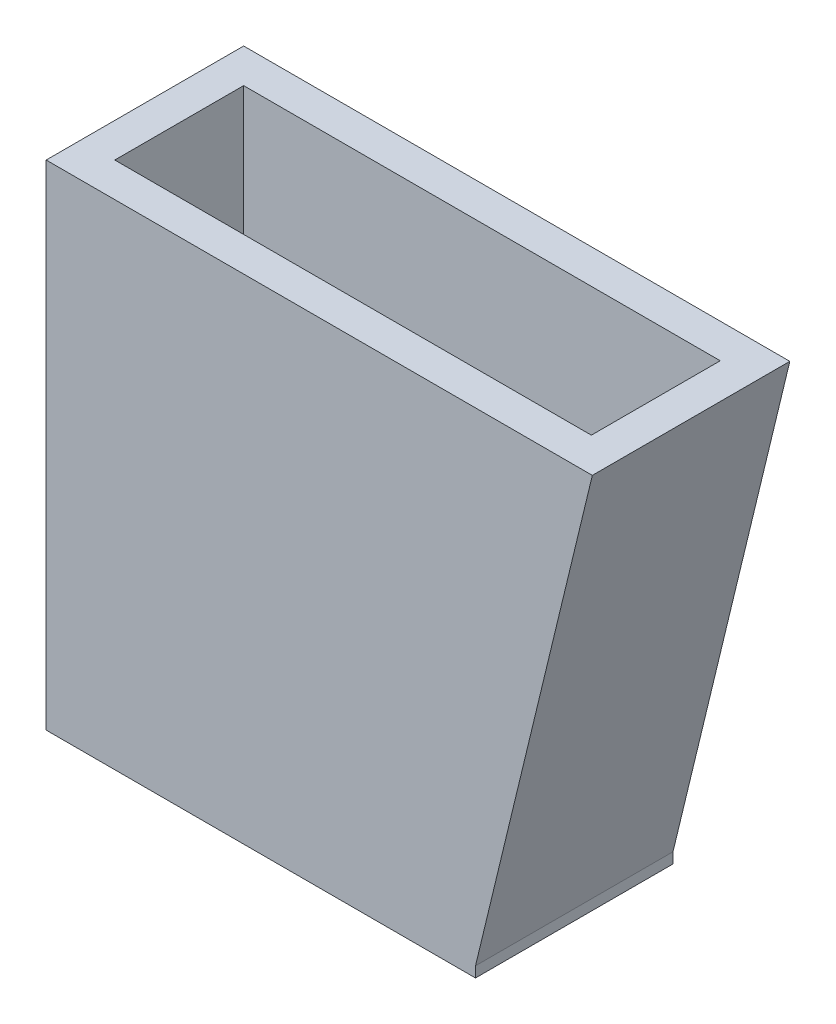
ISO-10303-21;
HEADER;
FILE_DESCRIPTION(('STEP AP214'),'2;1');
FILE_NAME('part.step','',(''),(''),'','','');
FILE_SCHEMA(('AUTOMOTIVE_DESIGN { 1 0 10303 214 1 1 1 1 }'));
ENDSEC;
DATA;
#1=APPLICATION_CONTEXT('core data for automotive mechanical design processes');
#2=APPLICATION_PROTOCOL_DEFINITION('international standard','automotive_design',2000,#1);
#3=PRODUCT_CONTEXT('',#1,'mechanical');
#4=PRODUCT('Part','Part','',(#3));
#5=PRODUCT_RELATED_PRODUCT_CATEGORY('part','',(#4));
#6=PRODUCT_DEFINITION_FORMATION('','',#4);
#7=PRODUCT_DEFINITION_CONTEXT('part definition',#1,'design');
#8=PRODUCT_DEFINITION('design','',#6,#7);
#9=PRODUCT_DEFINITION_SHAPE('','',#8);
#10=(LENGTH_UNIT() NAMED_UNIT(*) SI_UNIT(.MILLI.,.METRE.));
#11=(NAMED_UNIT(*) PLANE_ANGLE_UNIT() SI_UNIT($,.RADIAN.));
#12=(NAMED_UNIT(*) SI_UNIT($,.STERADIAN.) SOLID_ANGLE_UNIT());
#13=UNCERTAINTY_MEASURE_WITH_UNIT(LENGTH_MEASURE(1.E-05),#10,'distance_accuracy_value','');
#14=(GEOMETRIC_REPRESENTATION_CONTEXT(3) GLOBAL_UNCERTAINTY_ASSIGNED_CONTEXT((#13)) GLOBAL_UNIT_ASSIGNED_CONTEXT((#10,
#11,#12)) REPRESENTATION_CONTEXT('',''));
#15=CARTESIAN_POINT('',(0.,0.,0.));
#16=DIRECTION('',(0.,0.,1.));
#17=DIRECTION('',(1.,0.,0.));
#18=AXIS2_PLACEMENT_3D('',#15,#16,#17);
#19=CARTESIAN_POINT('',(20.,255.,0.));
#20=DIRECTION('',(0.,1.,0.));
#21=DIRECTION('',(0.,0.,1.));
#22=AXIS2_PLACEMENT_3D('',#19,#20,#21);
#23=PLANE('',#22);
#24=DIRECTION('',(-1.,0.,0.));
#25=VECTOR('',#24,1.);
#26=CARTESIAN_POINT('',(-105.,255.,66.99));
#27=LINE('',#26,#25);
#28=CARTESIAN_POINT('',(12.01,255.,66.99));
#29=VERTEX_POINT('',#28);
#30=CARTESIAN_POINT('',(-72.01,255.,66.99));
#31=VERTEX_POINT('',#30);
#32=EDGE_CURVE('E45',#29,#31,#27,.T.);
#33=ORIENTED_EDGE('',*,*,#32,.T.);
#34=DIRECTION('',(0.,0.,-1.));
#35=VECTOR('',#34,1.);
#36=CARTESIAN_POINT('',(-72.01,255.,105.));
#37=LINE('',#36,#35);
#38=CARTESIAN_POINT('',(-72.01,255.,97.01));
#39=VERTEX_POINT('',#38);
#40=EDGE_CURVE('E157',#39,#31,#37,.T.);
#41=ORIENTED_EDGE('',*,*,#40,.F.);
#42=DIRECTION('',(-1.,0.,0.));
#43=VECTOR('',#42,1.);
#44=CARTESIAN_POINT('',(0.,255.,97.01));
#45=LINE('',#44,#43);
#46=CARTESIAN_POINT('',(12.01,255.,97.01));
#47=VERTEX_POINT('',#46);
#48=EDGE_CURVE('E127',#47,#39,#45,.T.);
#49=ORIENTED_EDGE('',*,*,#48,.F.);
#50=DIRECTION('',(0.,0.,-1.));
#51=VECTOR('',#50,1.);
#52=CARTESIAN_POINT('',(12.01,255.,105.));
#53=LINE('',#52,#51);
#54=EDGE_CURVE('E158',#47,#29,#53,.T.);
#55=ORIENTED_EDGE('',*,*,#54,.T.);
#56=EDGE_LOOP('',(#33,#41,#49,#55));
#57=FACE_BOUND('',#56,.T.);
#58=DIRECTION('',(-1.,0.,0.));
#59=VECTOR('',#58,1.);
#60=CARTESIAN_POINT('',(0.,255.,105.));
#61=LINE('',#60,#59);
#62=CARTESIAN_POINT('',(20.,255.,105.));
#63=VERTEX_POINT('',#62);
#64=CARTESIAN_POINT('',(-80.,255.,105.));
#65=VERTEX_POINT('',#64);
#66=EDGE_CURVE('E50',#63,#65,#61,.T.);
#67=ORIENTED_EDGE('',*,*,#66,.T.);
#68=DIRECTION('',(0.,0.,-1.));
#69=VECTOR('',#68,1.);
#70=CARTESIAN_POINT('',(-80.,255.,105.));
#71=LINE('',#70,#69);
#72=CARTESIAN_POINT('',(-80.,255.,59.));
#73=VERTEX_POINT('',#72);
#74=EDGE_CURVE('E152',#65,#73,#71,.T.);
#75=ORIENTED_EDGE('',*,*,#74,.T.);
#76=DIRECTION('',(1.,0.,0.));
#77=VECTOR('',#76,1.);
#78=CARTESIAN_POINT('',(-105.,255.,59.));
#79=LINE('',#78,#77);
#80=CARTESIAN_POINT('',(20.,255.,59.));
#81=VERTEX_POINT('',#80);
#82=EDGE_CURVE('E11',#73,#81,#79,.T.);
#83=ORIENTED_EDGE('',*,*,#82,.T.);
#84=DIRECTION('',(0.,0.,-1.));
#85=VECTOR('',#84,1.);
#86=CARTESIAN_POINT('',(20.,255.,105.));
#87=LINE('',#86,#85);
#88=EDGE_CURVE('E58',#63,#81,#87,.T.);
#89=ORIENTED_EDGE('',*,*,#88,.F.);
#90=EDGE_LOOP('',(#67,#75,#83,#89));
#91=FACE_BOUND('',#90,.T.);
#92=ADVANCED_FACE('F42',(#57,#91),#23,.F.);
#93=CARTESIAN_POINT('',(-47.6888596699602,11.5317898279554,105.));
#94=DIRECTION('',(-0.971985961105254,0.235038914680729,0.));
#95=DIRECTION('',(-0.235038914680729,-0.971985961105254,0.));
#96=AXIS2_PLACEMENT_3D('',#93,#94,#95);
#97=PLANE('',#96);
#98=DIRECTION('',(0.235038914680729,0.971985961105254,0.));
#99=VECTOR('',#98,1.);
#100=CARTESIAN_POINT('',(-47.6888596699602,11.5317898279554,97.01));
#101=LINE('',#100,#99);
#102=CARTESIAN_POINT('',(12.01,258.411986547786,97.01));
#103=VERTEX_POINT('',#102);
#104=CARTESIAN_POINT('',(38.993440731349,370.,97.01));
#105=VERTEX_POINT('',#104);
#106=EDGE_CURVE('E168',#103,#105,#101,.T.);
#107=ORIENTED_EDGE('',*,*,#106,.T.);
#108=DIRECTION('',(0.,0.,-1.));
#109=VECTOR('',#108,1.);
#110=CARTESIAN_POINT('',(38.993440731349,370.,105.));
#111=LINE('',#110,#109);
#112=CARTESIAN_POINT('',(38.993440731349,370.,66.99));
#113=VERTEX_POINT('',#112);
#114=EDGE_CURVE('E146',#105,#113,#111,.T.);
#115=ORIENTED_EDGE('',*,*,#114,.T.);
#116=DIRECTION('',(0.235038914680729,0.971985961105254,0.));
#117=VECTOR('',#116,1.);
#118=CARTESIAN_POINT('',(-47.6888596699602,11.5317898279554,66.9900000000001));
#119=LINE('',#118,#117);
#120=CARTESIAN_POINT('',(12.01,258.411986547786,66.99));
#121=VERTEX_POINT('',#120);
#122=EDGE_CURVE('E130',#121,#113,#119,.T.);
#123=ORIENTED_EDGE('',*,*,#122,.F.);
#124=DIRECTION('',(0.,0.,-1.));
#125=VECTOR('',#124,1.);
#126=CARTESIAN_POINT('',(12.01,258.411986547786,105.));
#127=LINE('',#126,#125);
#128=EDGE_CURVE('E178',#103,#121,#127,.T.);
#129=ORIENTED_EDGE('',*,*,#128,.F.);
#130=EDGE_LOOP('',(#107,#115,#123,#129));
#131=FACE_BOUND('',#130,.T.);
#132=ADVANCED_FACE('F218',(#131),#97,.T.);
#133=CARTESIAN_POINT('',(-80.,0.,105.));
#134=DIRECTION('',(-1.,0.,0.));
#135=DIRECTION('',(0.,0.,1.));
#136=AXIS2_PLACEMENT_3D('',#133,#134,#135);
#137=PLANE('',#136);
#138=ORIENTED_EDGE('',*,*,#74,.F.);
#139=DIRECTION('',(0.,1.,0.));
#140=VECTOR('',#139,1.);
#141=CARTESIAN_POINT('',(-80.,0.,105.));
#142=LINE('',#141,#140);
#143=CARTESIAN_POINT('',(-80.,370.,105.));
#144=VERTEX_POINT('',#143);
#145=EDGE_CURVE('E186',#65,#144,#142,.T.);
#146=ORIENTED_EDGE('',*,*,#145,.T.);
#147=DIRECTION('',(0.,0.,-1.));
#148=VECTOR('',#147,1.);
#149=CARTESIAN_POINT('',(-80.,370.,105.));
#150=LINE('',#149,#148);
#151=CARTESIAN_POINT('',(-80.,370.,59.));
#152=VERTEX_POINT('',#151);
#153=EDGE_CURVE('E193',#144,#152,#150,.T.);
#154=ORIENTED_EDGE('',*,*,#153,.T.);
#155=DIRECTION('',(0.,1.,0.));
#156=VECTOR('',#155,1.);
#157=CARTESIAN_POINT('',(-80.,0.,59.0000000000001));
#158=LINE('',#157,#156);
#159=EDGE_CURVE('E188',#73,#152,#158,.T.);
#160=ORIENTED_EDGE('',*,*,#159,.F.);
#161=EDGE_LOOP('',(#138,#146,#154,#160));
#162=FACE_BOUND('',#161,.T.);
#163=ADVANCED_FACE('F202',(#162),#137,.T.);
#164=CARTESIAN_POINT('',(0.,370.,0.));
#165=DIRECTION('',(0.,1.,0.));
#166=DIRECTION('',(0.,0.,1.));
#167=AXIS2_PLACEMENT_3D('',#164,#165,#166);
#168=PLANE('',#167);
#169=ORIENTED_EDGE('',*,*,#114,.F.);
#170=DIRECTION('',(-1.,0.,0.));
#171=VECTOR('',#170,1.);
#172=CARTESIAN_POINT('',(0.,370.,97.01));
#173=LINE('',#172,#171);
#174=CARTESIAN_POINT('',(-72.01,370.,97.01));
#175=VERTEX_POINT('',#174);
#176=EDGE_CURVE('E125',#105,#175,#173,.T.);
#177=ORIENTED_EDGE('',*,*,#176,.T.);
#178=DIRECTION('',(0.,0.,-1.));
#179=VECTOR('',#178,1.);
#180=CARTESIAN_POINT('',(-72.01,370.,105.));
#181=LINE('',#180,#179);
#182=CARTESIAN_POINT('',(-72.01,370.,66.99));
#183=VERTEX_POINT('',#182);
#184=EDGE_CURVE('E134',#175,#183,#181,.T.);
#185=ORIENTED_EDGE('',*,*,#184,.T.);
#186=DIRECTION('',(-1.,0.,0.));
#187=VECTOR('',#186,1.);
#188=CARTESIAN_POINT('',(-105.,370.,66.99));
#189=LINE('',#188,#187);
#190=EDGE_CURVE('E167',#113,#183,#189,.T.);
#191=ORIENTED_EDGE('',*,*,#190,.F.);
#192=EDGE_LOOP('',(#169,#177,#185,#191));
#193=FACE_BOUND('',#192,.T.);
#194=DIRECTION('',(-1.,0.,0.));
#195=VECTOR('',#194,1.);
#196=CARTESIAN_POINT('',(0.,370.,105.));
#197=LINE('',#196,#195);
#198=CARTESIAN_POINT('',(47.2137240684813,370.,105.));
#199=VERTEX_POINT('',#198);
#200=EDGE_CURVE('E205',#199,#144,#197,.T.);
#201=ORIENTED_EDGE('',*,*,#200,.F.);
#202=DIRECTION('',(0.,0.,-1.));
#203=VECTOR('',#202,1.);
#204=CARTESIAN_POINT('',(47.2137240684813,370.,105.));
#205=LINE('',#204,#203);
#206=CARTESIAN_POINT('',(47.2137240684813,370.,59.));
#207=VERTEX_POINT('',#206);
#208=EDGE_CURVE('E191',#199,#207,#205,.T.);
#209=ORIENTED_EDGE('',*,*,#208,.T.);
#210=DIRECTION('',(-1.,0.,0.));
#211=VECTOR('',#210,1.);
#212=CARTESIAN_POINT('',(-105.,370.,59.));
#213=LINE('',#212,#211);
#214=EDGE_CURVE('E140',#207,#152,#213,.T.);
#215=ORIENTED_EDGE('',*,*,#214,.T.);
#216=ORIENTED_EDGE('',*,*,#153,.F.);
#217=EDGE_LOOP('',(#201,#209,#215,#216));
#218=FACE_BOUND('',#217,.T.);
#219=ADVANCED_FACE('F143',(#193,#218),#168,.T.);
#220=CARTESIAN_POINT('',(-39.9226918407293,9.65382889965641,105.));
#221=DIRECTION('',(-0.971985961105254,0.235038914680729,0.));
#222=DIRECTION('',(-0.235038914680729,-0.971985961105254,0.));
#223=AXIS2_PLACEMENT_3D('',#220,#221,#222);
#224=PLANE('',#223);
#225=ORIENTED_EDGE('',*,*,#208,.F.);
#226=DIRECTION('',(0.235038914680729,0.971985961105254,0.));
#227=VECTOR('',#226,1.);
#228=CARTESIAN_POINT('',(-39.9226918407293,9.65382889965641,105.));
#229=LINE('',#228,#227);
#230=CARTESIAN_POINT('',(20.,257.459666924148,105.));
#231=VERTEX_POINT('',#230);
#232=EDGE_CURVE('E181',#231,#199,#229,.T.);
#233=ORIENTED_EDGE('',*,*,#232,.F.);
#234=DIRECTION('',(0.,0.,-1.));
#235=VECTOR('',#234,1.);
#236=CARTESIAN_POINT('',(20.,257.459666924148,105.));
#237=LINE('',#236,#235);
#238=CARTESIAN_POINT('',(20.,257.459666924148,59.));
#239=VERTEX_POINT('',#238);
#240=EDGE_CURVE('E177',#231,#239,#237,.T.);
#241=ORIENTED_EDGE('',*,*,#240,.T.);
#242=DIRECTION('',(0.235038914680729,0.971985961105254,0.));
#243=VECTOR('',#242,1.);
#244=CARTESIAN_POINT('',(-39.9226918407293,9.65382889965641,59.0000000000001));
#245=LINE('',#244,#243);
#246=EDGE_CURVE('E175',#239,#207,#245,.T.);
#247=ORIENTED_EDGE('',*,*,#246,.T.);
#248=EDGE_LOOP('',(#225,#233,#241,#247));
#249=FACE_BOUND('',#248,.T.);
#250=ADVANCED_FACE('F235',(#249),#224,.F.);
#251=CARTESIAN_POINT('',(20.,0.,105.));
#252=DIRECTION('',(-1.,0.,0.));
#253=DIRECTION('',(0.,0.,1.));
#254=AXIS2_PLACEMENT_3D('',#251,#252,#253);
#255=PLANE('',#254);
#256=DIRECTION('',(0.,1.,0.));
#257=VECTOR('',#256,1.);
#258=CARTESIAN_POINT('',(20.,0.,105.));
#259=LINE('',#258,#257);
#260=EDGE_CURVE('E184',#63,#231,#259,.T.);
#261=ORIENTED_EDGE('',*,*,#260,.F.);
#262=ORIENTED_EDGE('',*,*,#88,.T.);
#263=DIRECTION('',(0.,1.,0.));
#264=VECTOR('',#263,1.);
#265=CARTESIAN_POINT('',(20.,0.,59.0000000000001));
#266=LINE('',#265,#264);
#267=EDGE_CURVE('E155',#81,#239,#266,.T.);
#268=ORIENTED_EDGE('',*,*,#267,.T.);
#269=ORIENTED_EDGE('',*,*,#240,.F.);
#270=EDGE_LOOP('',(#261,#262,#268,#269));
#271=FACE_BOUND('',#270,.T.);
#272=ADVANCED_FACE('F237',(#271),#255,.F.);
#273=CARTESIAN_POINT('',(0.,0.,105.));
#274=DIRECTION('',(0.,0.,1.));
#275=DIRECTION('',(1.,0.,0.));
#276=AXIS2_PLACEMENT_3D('',#273,#274,#275);
#277=PLANE('',#276);
#278=ORIENTED_EDGE('',*,*,#66,.F.);
#279=ORIENTED_EDGE('',*,*,#260,.T.);
#280=ORIENTED_EDGE('',*,*,#232,.T.);
#281=ORIENTED_EDGE('',*,*,#200,.T.);
#282=ORIENTED_EDGE('',*,*,#145,.F.);
#283=EDGE_LOOP('',(#278,#279,#280,#281,#282));
#284=FACE_BOUND('',#283,.T.);
#285=ADVANCED_FACE('F241',(#284),#277,.T.);
#286=CARTESIAN_POINT('',(-105.,520.,59.));
#287=DIRECTION('',(0.,0.,1.));
#288=DIRECTION('',(0.,-1.,0.));
#289=AXIS2_PLACEMENT_3D('',#286,#287,#288);
#290=PLANE('',#289);
#291=ORIENTED_EDGE('',*,*,#214,.F.);
#292=ORIENTED_EDGE('',*,*,#246,.F.);
#293=ORIENTED_EDGE('',*,*,#267,.F.);
#294=ORIENTED_EDGE('',*,*,#82,.F.);
#295=ORIENTED_EDGE('',*,*,#159,.T.);
#296=EDGE_LOOP('',(#291,#292,#293,#294,#295));
#297=FACE_BOUND('',#296,.T.);
#298=ADVANCED_FACE('F199',(#297),#290,.F.);
#299=CARTESIAN_POINT('',(-72.01,0.,105.));
#300=DIRECTION('',(-1.,0.,0.));
#301=DIRECTION('',(0.,0.,1.));
#302=AXIS2_PLACEMENT_3D('',#299,#300,#301);
#303=PLANE('',#302);
#304=DIRECTION('',(0.,1.,0.));
#305=VECTOR('',#304,1.);
#306=CARTESIAN_POINT('',(-72.01,0.,97.01));
#307=LINE('',#306,#305);
#308=EDGE_CURVE('E119',#39,#175,#307,.T.);
#309=ORIENTED_EDGE('',*,*,#308,.F.);
#310=ORIENTED_EDGE('',*,*,#40,.T.);
#311=DIRECTION('',(0.,1.,0.));
#312=VECTOR('',#311,1.);
#313=CARTESIAN_POINT('',(-72.01,0.,66.9900000000001));
#314=LINE('',#313,#312);
#315=EDGE_CURVE('E137',#31,#183,#314,.T.);
#316=ORIENTED_EDGE('',*,*,#315,.T.);
#317=ORIENTED_EDGE('',*,*,#184,.F.);
#318=EDGE_LOOP('',(#309,#310,#316,#317));
#319=FACE_BOUND('',#318,.T.);
#320=ADVANCED_FACE('F135',(#319),#303,.F.);
#321=CARTESIAN_POINT('',(12.01,0.,105.));
#322=DIRECTION('',(-1.,0.,0.));
#323=DIRECTION('',(0.,0.,1.));
#324=AXIS2_PLACEMENT_3D('',#321,#322,#323);
#325=PLANE('',#324);
#326=ORIENTED_EDGE('',*,*,#54,.F.);
#327=DIRECTION('',(0.,1.,0.));
#328=VECTOR('',#327,1.);
#329=CARTESIAN_POINT('',(12.01,0.,97.01));
#330=LINE('',#329,#328);
#331=EDGE_CURVE('E170',#47,#103,#330,.T.);
#332=ORIENTED_EDGE('',*,*,#331,.T.);
#333=ORIENTED_EDGE('',*,*,#128,.T.);
#334=DIRECTION('',(0.,1.,0.));
#335=VECTOR('',#334,1.);
#336=CARTESIAN_POINT('',(12.01,0.,66.9900000000001));
#337=LINE('',#336,#335);
#338=EDGE_CURVE('E131',#29,#121,#337,.T.);
#339=ORIENTED_EDGE('',*,*,#338,.F.);
#340=EDGE_LOOP('',(#326,#332,#333,#339));
#341=FACE_BOUND('',#340,.T.);
#342=ADVANCED_FACE('F215',(#341),#325,.T.);
#343=CARTESIAN_POINT('',(0.,0.,97.01));
#344=DIRECTION('',(0.,0.,1.));
#345=DIRECTION('',(1.,0.,0.));
#346=AXIS2_PLACEMENT_3D('',#343,#344,#345);
#347=PLANE('',#346);
#348=ORIENTED_EDGE('',*,*,#331,.F.);
#349=ORIENTED_EDGE('',*,*,#48,.T.);
#350=ORIENTED_EDGE('',*,*,#308,.T.);
#351=ORIENTED_EDGE('',*,*,#176,.F.);
#352=ORIENTED_EDGE('',*,*,#106,.F.);
#353=EDGE_LOOP('',(#348,#349,#350,#351,#352));
#354=FACE_BOUND('',#353,.T.);
#355=ADVANCED_FACE('F122',(#354),#347,.F.);
#356=CARTESIAN_POINT('',(-105.,520.,66.99));
#357=DIRECTION('',(0.,0.,1.));
#358=DIRECTION('',(0.,-1.,0.));
#359=AXIS2_PLACEMENT_3D('',#356,#357,#358);
#360=PLANE('',#359);
#361=ORIENTED_EDGE('',*,*,#32,.F.);
#362=ORIENTED_EDGE('',*,*,#338,.T.);
#363=ORIENTED_EDGE('',*,*,#122,.T.);
#364=ORIENTED_EDGE('',*,*,#190,.T.);
#365=ORIENTED_EDGE('',*,*,#315,.F.);
#366=EDGE_LOOP('',(#361,#362,#363,#364,#365));
#367=FACE_BOUND('',#366,.T.);
#368=ADVANCED_FACE('F165',(#367),#360,.T.);
#369=CLOSED_SHELL('',(#92,#132,#163,#219,#250,#272,#285,#298,#320,#342,#355,#368));
#370=MANIFOLD_SOLID_BREP('B2',#369);
#371=ADVANCED_BREP_SHAPE_REPRESENTATION('',(#18,#370),#14);
#372=SHAPE_DEFINITION_REPRESENTATION(#9,#371);
ENDSEC;
END-ISO-10303-21;
